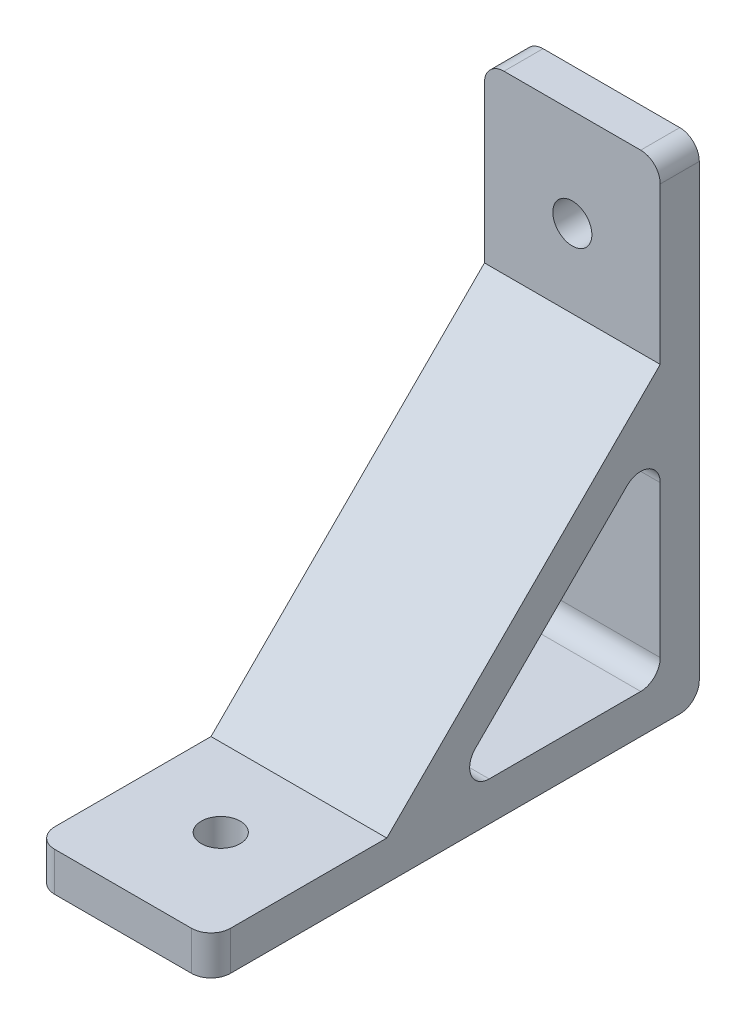
ISO-10303-21;
HEADER;
FILE_DESCRIPTION(('STEP AP214'),'2;1');
FILE_NAME('part.step','',(''),(''),'','','');
FILE_SCHEMA(('AUTOMOTIVE_DESIGN { 1 0 10303 214 1 1 1 1 }'));
ENDSEC;
DATA;
#1=APPLICATION_CONTEXT('core data for automotive mechanical design processes');
#2=APPLICATION_PROTOCOL_DEFINITION('international standard','automotive_design',2000,#1);
#3=PRODUCT_CONTEXT('',#1,'mechanical');
#4=PRODUCT('Part','Part','',(#3));
#5=PRODUCT_RELATED_PRODUCT_CATEGORY('part','',(#4));
#6=PRODUCT_DEFINITION_FORMATION('','',#4);
#7=PRODUCT_DEFINITION_CONTEXT('part definition',#1,'design');
#8=PRODUCT_DEFINITION('design','',#6,#7);
#9=PRODUCT_DEFINITION_SHAPE('','',#8);
#10=(LENGTH_UNIT() NAMED_UNIT(*) SI_UNIT(.MILLI.,.METRE.));
#11=(NAMED_UNIT(*) PLANE_ANGLE_UNIT() SI_UNIT($,.RADIAN.));
#12=(NAMED_UNIT(*) SI_UNIT($,.STERADIAN.) SOLID_ANGLE_UNIT());
#13=UNCERTAINTY_MEASURE_WITH_UNIT(LENGTH_MEASURE(1.E-05),#10,'distance_accuracy_value','');
#14=(GEOMETRIC_REPRESENTATION_CONTEXT(3) GLOBAL_UNCERTAINTY_ASSIGNED_CONTEXT((#13)) GLOBAL_UNIT_ASSIGNED_CONTEXT((#10,
#11,#12)) REPRESENTATION_CONTEXT('',''));
#15=CARTESIAN_POINT('',(0.,0.,0.));
#16=DIRECTION('',(0.,0.,1.));
#17=DIRECTION('',(1.,0.,0.));
#18=AXIS2_PLACEMENT_3D('',#15,#16,#17);
#19=CARTESIAN_POINT('',(18.,100.,-50.));
#20=DIRECTION('',(-1.,0.,0.));
#21=DIRECTION('',(0.,0.,1.));
#22=AXIS2_PLACEMENT_3D('',#19,#20,#21);
#23=PLANE('',#22);
#24=DIRECTION('',(0.,0.,-1.));
#25=VECTOR('',#24,1.);
#26=CARTESIAN_POINT('',(18.,8.,-38.));
#27=LINE('',#26,#25);
#28=CARTESIAN_POINT('',(18.,8.,-6.97056274847713));
#29=VERTEX_POINT('',#28);
#30=CARTESIAN_POINT('',(18.,8.,-38.));
#31=VERTEX_POINT('',#30);
#32=EDGE_CURVE('E229',#29,#31,#27,.T.);
#33=ORIENTED_EDGE('',*,*,#32,.F.);
#34=CARTESIAN_POINT('',(18.,12.,-6.97056274847713));
#35=DIRECTION('',(1.,0.,0.));
#36=DIRECTION('',(0.,0.,-1.));
#37=AXIS2_PLACEMENT_3D('',#34,#35,#36);
#38=CIRCLE('',#37,4.);
#39=CARTESIAN_POINT('',(18.,14.8284271247462,-4.14213562373094));
#40=VERTEX_POINT('',#39);
#41=EDGE_CURVE('E181',#40,#29,#38,.T.);
#42=ORIENTED_EDGE('',*,*,#41,.F.);
#43=DIRECTION('',(0.,-0.707106781186548,0.707106781186547));
#44=VECTOR('',#43,1.);
#45=CARTESIAN_POINT('',(18.,14.8284271247462,-4.14213562373094));
#46=LINE('',#45,#44);
#47=CARTESIAN_POINT('',(18.,45.8578643762691,-35.1715728752538));
#48=VERTEX_POINT('',#47);
#49=EDGE_CURVE('E313',#48,#40,#46,.T.);
#50=ORIENTED_EDGE('',*,*,#49,.F.);
#51=CARTESIAN_POINT('',(18.,43.0294372515229,-38.));
#52=DIRECTION('',(1.,0.,0.));
#53=DIRECTION('',(0.,0.,-1.));
#54=AXIS2_PLACEMENT_3D('',#51,#52,#53);
#55=CIRCLE('',#54,4.);
#56=CARTESIAN_POINT('',(18.,43.0294372515229,-42.));
#57=VERTEX_POINT('',#56);
#58=EDGE_CURVE('E310',#57,#48,#55,.T.);
#59=ORIENTED_EDGE('',*,*,#58,.F.);
#60=DIRECTION('',(0.,1.,0.));
#61=VECTOR('',#60,1.);
#62=CARTESIAN_POINT('',(18.,43.0294372515229,-42.));
#63=LINE('',#62,#61);
#64=CARTESIAN_POINT('',(18.,12.,-42.));
#65=VERTEX_POINT('',#64);
#66=EDGE_CURVE('E307',#65,#57,#63,.T.);
#67=ORIENTED_EDGE('',*,*,#66,.F.);
#68=CARTESIAN_POINT('',(18.,12.,-38.));
#69=DIRECTION('',(1.,0.,0.));
#70=DIRECTION('',(0.,0.,-1.));
#71=AXIS2_PLACEMENT_3D('',#68,#69,#70);
#72=CIRCLE('',#71,4.);
#73=EDGE_CURVE('E304',#31,#65,#72,.T.);
#74=ORIENTED_EDGE('',*,*,#73,.F.);
#75=EDGE_LOOP('',(#33,#42,#50,#59,#67,#74));
#76=FACE_BOUND('',#75,.T.);
#77=DIRECTION('',(0.,0.,-1.));
#78=VECTOR('',#77,1.);
#79=CARTESIAN_POINT('',(18.,0.,-50.));
#80=LINE('',#79,#78);
#81=CARTESIAN_POINT('',(18.,0.,46.));
#82=VERTEX_POINT('',#81);
#83=CARTESIAN_POINT('',(18.,0.,-46.));
#84=VERTEX_POINT('',#83);
#85=EDGE_CURVE('E273',#82,#84,#80,.T.);
#86=ORIENTED_EDGE('',*,*,#85,.T.);
#87=CARTESIAN_POINT('',(18.,4.,-46.));
#88=DIRECTION('',(-1.,0.,0.));
#89=DIRECTION('',(0.,0.,1.));
#90=AXIS2_PLACEMENT_3D('',#87,#88,#89);
#91=CIRCLE('',#90,4.);
#92=CARTESIAN_POINT('',(18.,4.,-50.));
#93=VERTEX_POINT('',#92);
#94=EDGE_CURVE('E352',#84,#93,#91,.F.);
#95=ORIENTED_EDGE('',*,*,#94,.T.);
#96=DIRECTION('',(0.,-1.,0.));
#97=VECTOR('',#96,1.);
#98=CARTESIAN_POINT('',(18.,100.,-50.));
#99=LINE('',#98,#97);
#100=CARTESIAN_POINT('',(18.,96.,-50.));
#101=VERTEX_POINT('',#100);
#102=EDGE_CURVE('E293',#101,#93,#99,.T.);
#103=ORIENTED_EDGE('',*,*,#102,.F.);
#104=DIRECTION('',(0.,0.,-1.));
#105=VECTOR('',#104,1.);
#106=CARTESIAN_POINT('',(18.,96.,-42.));
#107=LINE('',#106,#105);
#108=CARTESIAN_POINT('',(18.,96.,-42.));
#109=VERTEX_POINT('',#108);
#110=EDGE_CURVE('E345',#101,#109,#107,.F.);
#111=ORIENTED_EDGE('',*,*,#110,.T.);
#112=DIRECTION('',(0.,-1.,0.));
#113=VECTOR('',#112,1.);
#114=CARTESIAN_POINT('',(18.,0.,-42.));
#115=LINE('',#114,#113);
#116=CARTESIAN_POINT('',(18.,64.,-42.));
#117=VERTEX_POINT('',#116);
#118=EDGE_CURVE('E240',#109,#117,#115,.T.);
#119=ORIENTED_EDGE('',*,*,#118,.T.);
#120=DIRECTION('',(0.,-0.707106781186548,0.707106781186547));
#121=VECTOR('',#120,1.);
#122=CARTESIAN_POINT('',(18.,11.,11.));
#123=LINE('',#122,#121);
#124=CARTESIAN_POINT('',(18.,7.99999999999999,14.));
#125=VERTEX_POINT('',#124);
#126=EDGE_CURVE('E243',#117,#125,#123,.T.);
#127=ORIENTED_EDGE('',*,*,#126,.T.);
#128=DIRECTION('',(0.,0.,-1.));
#129=VECTOR('',#128,1.);
#130=CARTESIAN_POINT('',(18.,7.99999999999999,0.));
#131=LINE('',#130,#129);
#132=CARTESIAN_POINT('',(18.,8.,46.));
#133=VERTEX_POINT('',#132);
#134=EDGE_CURVE('E247',#133,#125,#131,.T.);
#135=ORIENTED_EDGE('',*,*,#134,.F.);
#136=DIRECTION('',(0.,-1.,0.));
#137=VECTOR('',#136,1.);
#138=CARTESIAN_POINT('',(18.,100.,46.));
#139=LINE('',#138,#137);
#140=EDGE_CURVE('E348',#133,#82,#139,.T.);
#141=ORIENTED_EDGE('',*,*,#140,.T.);
#142=EDGE_LOOP('',(#86,#95,#103,#111,#119,#127,#135,#141));
#143=FACE_BOUND('',#142,.T.);
#144=ADVANCED_FACE('F45',(#76,#143),#23,.F.);
#145=CARTESIAN_POINT('',(-18.,100.,-50.));
#146=DIRECTION('',(1.,0.,0.));
#147=DIRECTION('',(0.,0.,-1.));
#148=AXIS2_PLACEMENT_3D('',#145,#146,#147);
#149=PLANE('',#148);
#150=DIRECTION('',(0.,-0.707106781186548,0.707106781186547));
#151=VECTOR('',#150,1.);
#152=CARTESIAN_POINT('',(-18.,14.8284271247462,-4.14213562373094));
#153=LINE('',#152,#151);
#154=CARTESIAN_POINT('',(-18.,45.8578643762691,-35.1715728752538));
#155=VERTEX_POINT('',#154);
#156=CARTESIAN_POINT('',(-18.,14.8284271247462,-4.14213562373094));
#157=VERTEX_POINT('',#156);
#158=EDGE_CURVE('E186',#155,#157,#153,.T.);
#159=ORIENTED_EDGE('',*,*,#158,.T.);
#160=CARTESIAN_POINT('',(-18.,12.,-6.97056274847713));
#161=DIRECTION('',(1.,0.,0.));
#162=DIRECTION('',(0.,0.,1.));
#163=AXIS2_PLACEMENT_3D('',#160,#161,#162);
#164=CIRCLE('',#163,4.);
#165=CARTESIAN_POINT('',(-18.,8.,-6.97056274847713));
#166=VERTEX_POINT('',#165);
#167=EDGE_CURVE('E178',#157,#166,#164,.T.);
#168=ORIENTED_EDGE('',*,*,#167,.T.);
#169=DIRECTION('',(0.,0.,-1.));
#170=VECTOR('',#169,1.);
#171=CARTESIAN_POINT('',(-18.,8.,-38.));
#172=LINE('',#171,#170);
#173=CARTESIAN_POINT('',(-18.,8.00000000000001,-38.));
#174=VERTEX_POINT('',#173);
#175=EDGE_CURVE('E190',#166,#174,#172,.T.);
#176=ORIENTED_EDGE('',*,*,#175,.T.);
#177=CARTESIAN_POINT('',(-18.,12.,-38.));
#178=DIRECTION('',(1.,0.,0.));
#179=DIRECTION('',(0.,0.,-1.));
#180=AXIS2_PLACEMENT_3D('',#177,#178,#179);
#181=CIRCLE('',#180,4.);
#182=CARTESIAN_POINT('',(-18.,12.,-42.));
#183=VERTEX_POINT('',#182);
#184=EDGE_CURVE('E196',#174,#183,#181,.T.);
#185=ORIENTED_EDGE('',*,*,#184,.T.);
#186=DIRECTION('',(0.,1.,0.));
#187=VECTOR('',#186,1.);
#188=CARTESIAN_POINT('',(-18.,43.0294372515229,-42.));
#189=LINE('',#188,#187);
#190=CARTESIAN_POINT('',(-18.,43.0294372515229,-42.));
#191=VERTEX_POINT('',#190);
#192=EDGE_CURVE('E213',#183,#191,#189,.T.);
#193=ORIENTED_EDGE('',*,*,#192,.T.);
#194=CARTESIAN_POINT('',(-18.,43.0294372515229,-38.));
#195=DIRECTION('',(1.,0.,0.));
#196=DIRECTION('',(0.,0.,-1.));
#197=AXIS2_PLACEMENT_3D('',#194,#195,#196);
#198=CIRCLE('',#197,4.);
#199=EDGE_CURVE('E217',#191,#155,#198,.T.);
#200=ORIENTED_EDGE('',*,*,#199,.T.);
#201=EDGE_LOOP('',(#159,#168,#176,#185,#193,#200));
#202=FACE_BOUND('',#201,.T.);
#203=DIRECTION('',(0.,-1.,0.));
#204=VECTOR('',#203,1.);
#205=CARTESIAN_POINT('',(-18.,100.,-50.));
#206=LINE('',#205,#204);
#207=CARTESIAN_POINT('',(-18.,96.,-50.));
#208=VERTEX_POINT('',#207);
#209=CARTESIAN_POINT('',(-18.,4.,-50.));
#210=VERTEX_POINT('',#209);
#211=EDGE_CURVE('E278',#208,#210,#206,.T.);
#212=ORIENTED_EDGE('',*,*,#211,.T.);
#213=CARTESIAN_POINT('',(-18.,4.,-46.));
#214=DIRECTION('',(1.,0.,0.));
#215=DIRECTION('',(0.,0.,-1.));
#216=AXIS2_PLACEMENT_3D('',#213,#214,#215);
#217=CIRCLE('',#216,4.);
#218=CARTESIAN_POINT('',(-18.,0.,-46.));
#219=VERTEX_POINT('',#218);
#220=EDGE_CURVE('E333',#210,#219,#217,.F.);
#221=ORIENTED_EDGE('',*,*,#220,.T.);
#222=DIRECTION('',(0.,0.,1.));
#223=VECTOR('',#222,1.);
#224=CARTESIAN_POINT('',(-18.,0.,-50.));
#225=LINE('',#224,#223);
#226=CARTESIAN_POINT('',(-18.,0.,46.));
#227=VERTEX_POINT('',#226);
#228=EDGE_CURVE('E283',#219,#227,#225,.T.);
#229=ORIENTED_EDGE('',*,*,#228,.T.);
#230=DIRECTION('',(0.,-1.,0.));
#231=VECTOR('',#230,1.);
#232=CARTESIAN_POINT('',(-18.,100.,46.));
#233=LINE('',#232,#231);
#234=CARTESIAN_POINT('',(-18.,7.99999999999999,46.));
#235=VERTEX_POINT('',#234);
#236=EDGE_CURVE('E330',#227,#235,#233,.F.);
#237=ORIENTED_EDGE('',*,*,#236,.T.);
#238=DIRECTION('',(0.,0.,1.));
#239=VECTOR('',#238,1.);
#240=CARTESIAN_POINT('',(-18.,7.99999999999998,-50.));
#241=LINE('',#240,#239);
#242=CARTESIAN_POINT('',(-18.,7.99999999999999,14.));
#243=VERTEX_POINT('',#242);
#244=EDGE_CURVE('E269',#243,#235,#241,.T.);
#245=ORIENTED_EDGE('',*,*,#244,.F.);
#246=DIRECTION('',(0.,0.707106781186548,-0.707106781186547));
#247=VECTOR('',#246,1.);
#248=CARTESIAN_POINT('',(-18.,86.,-64.));
#249=LINE('',#248,#247);
#250=CARTESIAN_POINT('',(-18.,64.,-42.));
#251=VERTEX_POINT('',#250);
#252=EDGE_CURVE('E297',#243,#251,#249,.T.);
#253=ORIENTED_EDGE('',*,*,#252,.T.);
#254=DIRECTION('',(0.,1.,0.));
#255=VECTOR('',#254,1.);
#256=CARTESIAN_POINT('',(-18.,100.,-42.));
#257=LINE('',#256,#255);
#258=CARTESIAN_POINT('',(-18.,96.,-42.));
#259=VERTEX_POINT('',#258);
#260=EDGE_CURVE('E255',#251,#259,#257,.T.);
#261=ORIENTED_EDGE('',*,*,#260,.T.);
#262=DIRECTION('',(0.,0.,1.));
#263=VECTOR('',#262,1.);
#264=CARTESIAN_POINT('',(-18.,96.,-50.));
#265=LINE('',#264,#263);
#266=EDGE_CURVE('E327',#259,#208,#265,.F.);
#267=ORIENTED_EDGE('',*,*,#266,.T.);
#268=EDGE_LOOP('',(#212,#221,#229,#237,#245,#253,#261,#267));
#269=FACE_BOUND('',#268,.T.);
#270=ADVANCED_FACE('F198',(#202,#269),#149,.F.);
#271=CARTESIAN_POINT('',(-18.,100.,50.));
#272=DIRECTION('',(0.,0.,-1.));
#273=DIRECTION('',(-1.,0.,0.));
#274=AXIS2_PLACEMENT_3D('',#271,#272,#273);
#275=PLANE('',#274);
#276=DIRECTION('',(-1.,0.,0.));
#277=VECTOR('',#276,1.);
#278=CARTESIAN_POINT('',(18.,8.,50.));
#279=LINE('',#278,#277);
#280=CARTESIAN_POINT('',(14.,8.,50.));
#281=VERTEX_POINT('',#280);
#282=CARTESIAN_POINT('',(-14.,8.,50.));
#283=VERTEX_POINT('',#282);
#284=EDGE_CURVE('E251',#281,#283,#279,.T.);
#285=ORIENTED_EDGE('',*,*,#284,.T.);
#286=DIRECTION('',(0.,-1.,0.));
#287=VECTOR('',#286,1.);
#288=CARTESIAN_POINT('',(-14.,100.,50.));
#289=LINE('',#288,#287);
#290=CARTESIAN_POINT('',(-14.,0.,50.));
#291=VERTEX_POINT('',#290);
#292=EDGE_CURVE('E358',#283,#291,#289,.T.);
#293=ORIENTED_EDGE('',*,*,#292,.T.);
#294=DIRECTION('',(1.,0.,0.));
#295=VECTOR('',#294,1.);
#296=CARTESIAN_POINT('',(-18.,0.,50.));
#297=LINE('',#296,#295);
#298=CARTESIAN_POINT('',(14.,0.,50.));
#299=VERTEX_POINT('',#298);
#300=EDGE_CURVE('E279',#291,#299,#297,.T.);
#301=ORIENTED_EDGE('',*,*,#300,.T.);
#302=DIRECTION('',(0.,-1.,0.));
#303=VECTOR('',#302,1.);
#304=CARTESIAN_POINT('',(14.,100.,50.));
#305=LINE('',#304,#303);
#306=EDGE_CURVE('E355',#299,#281,#305,.F.);
#307=ORIENTED_EDGE('',*,*,#306,.T.);
#308=EDGE_LOOP('',(#285,#293,#301,#307));
#309=FACE_BOUND('',#308,.T.);
#310=ADVANCED_FACE('F408',(#309),#275,.F.);
#311=CARTESIAN_POINT('',(-18.,100.,-50.));
#312=DIRECTION('',(0.,0.,1.));
#313=DIRECTION('',(1.,0.,0.));
#314=AXIS2_PLACEMENT_3D('',#311,#312,#313);
#315=PLANE('',#314);
#316=CARTESIAN_POINT('',(0.,80.,-50.));
#317=DIRECTION('',(0.,0.,1.));
#318=DIRECTION('',(1.,0.,0.));
#319=AXIS2_PLACEMENT_3D('',#316,#317,#318);
#320=CIRCLE('',#319,4.00000000000001);
#321=CARTESIAN_POINT('',(4.,80.,-50.));
#322=VERTEX_POINT('',#321);
#323=EDGE_CURVE('E503',#322,#322,#320,.T.);
#324=ORIENTED_EDGE('',*,*,#323,.T.);
#325=EDGE_LOOP('',(#324));
#326=FACE_BOUND('',#325,.T.);
#327=ORIENTED_EDGE('',*,*,#102,.T.);
#328=DIRECTION('',(-1.,0.,0.));
#329=VECTOR('',#328,1.);
#330=CARTESIAN_POINT('',(-18.,4.,-50.));
#331=LINE('',#330,#329);
#332=EDGE_CURVE('E323',#93,#210,#331,.T.);
#333=ORIENTED_EDGE('',*,*,#332,.T.);
#334=ORIENTED_EDGE('',*,*,#211,.F.);
#335=CARTESIAN_POINT('',(-14.,96.,-50.));
#336=DIRECTION('',(0.,0.,1.));
#337=DIRECTION('',(1.,0.,0.));
#338=AXIS2_PLACEMENT_3D('',#335,#336,#337);
#339=CIRCLE('',#338,4.);
#340=CARTESIAN_POINT('',(-14.,100.,-50.));
#341=VERTEX_POINT('',#340);
#342=EDGE_CURVE('E301',#208,#341,#339,.F.);
#343=ORIENTED_EDGE('',*,*,#342,.T.);
#344=DIRECTION('',(-1.,0.,0.));
#345=VECTOR('',#344,1.);
#346=CARTESIAN_POINT('',(-18.,100.,-50.));
#347=LINE('',#346,#345);
#348=CARTESIAN_POINT('',(14.,100.,-50.));
#349=VERTEX_POINT('',#348);
#350=EDGE_CURVE('E274',#349,#341,#347,.T.);
#351=ORIENTED_EDGE('',*,*,#350,.F.);
#352=CARTESIAN_POINT('',(14.,96.,-50.));
#353=DIRECTION('',(0.,0.,1.));
#354=DIRECTION('',(1.,0.,0.));
#355=AXIS2_PLACEMENT_3D('',#352,#353,#354);
#356=CIRCLE('',#355,4.);
#357=EDGE_CURVE('E320',#349,#101,#356,.F.);
#358=ORIENTED_EDGE('',*,*,#357,.T.);
#359=EDGE_LOOP('',(#327,#333,#334,#343,#351,#358));
#360=FACE_BOUND('',#359,.T.);
#361=ADVANCED_FACE('F383',(#326,#360),#315,.F.);
#362=CARTESIAN_POINT('',(0.,100.,0.));
#363=DIRECTION('',(0.,1.,0.));
#364=DIRECTION('',(0.,0.,1.));
#365=AXIS2_PLACEMENT_3D('',#362,#363,#364);
#366=PLANE('',#365);
#367=DIRECTION('',(-1.,0.,0.));
#368=VECTOR('',#367,1.);
#369=CARTESIAN_POINT('',(18.,100.,-42.));
#370=LINE('',#369,#368);
#371=CARTESIAN_POINT('',(14.,100.,-42.));
#372=VERTEX_POINT('',#371);
#373=CARTESIAN_POINT('',(-14.,100.,-42.));
#374=VERTEX_POINT('',#373);
#375=EDGE_CURVE('E250',#372,#374,#370,.T.);
#376=ORIENTED_EDGE('',*,*,#375,.F.);
#377=DIRECTION('',(0.,0.,-1.));
#378=VECTOR('',#377,1.);
#379=CARTESIAN_POINT('',(14.,100.,-50.));
#380=LINE('',#379,#378);
#381=EDGE_CURVE('E371',#372,#349,#380,.T.);
#382=ORIENTED_EDGE('',*,*,#381,.T.);
#383=ORIENTED_EDGE('',*,*,#350,.T.);
#384=DIRECTION('',(0.,0.,1.));
#385=VECTOR('',#384,1.);
#386=CARTESIAN_POINT('',(-14.,100.,-42.));
#387=LINE('',#386,#385);
#388=EDGE_CURVE('E368',#341,#374,#387,.T.);
#389=ORIENTED_EDGE('',*,*,#388,.T.);
#390=EDGE_LOOP('',(#376,#382,#383,#389));
#391=FACE_BOUND('',#390,.T.);
#392=ADVANCED_FACE('F385',(#391),#366,.T.);
#393=CARTESIAN_POINT('',(0.,0.,0.));
#394=DIRECTION('',(0.,1.,0.));
#395=DIRECTION('',(0.,0.,1.));
#396=AXIS2_PLACEMENT_3D('',#393,#394,#395);
#397=PLANE('',#396);
#398=CARTESIAN_POINT('',(0.,0.,30.));
#399=DIRECTION('',(0.,1.,0.));
#400=DIRECTION('',(0.,0.,1.));
#401=AXIS2_PLACEMENT_3D('',#398,#399,#400);
#402=CIRCLE('',#401,4.);
#403=CARTESIAN_POINT('',(0.,0.,34.));
#404=VERTEX_POINT('',#403);
#405=EDGE_CURVE('E207',#404,#404,#402,.T.);
#406=ORIENTED_EDGE('',*,*,#405,.T.);
#407=EDGE_LOOP('',(#406));
#408=FACE_BOUND('',#407,.T.);
#409=ORIENTED_EDGE('',*,*,#228,.F.);
#410=DIRECTION('',(-1.,0.,0.));
#411=VECTOR('',#410,1.);
#412=CARTESIAN_POINT('',(0.,0.,-46.));
#413=LINE('',#412,#411);
#414=EDGE_CURVE('E342',#219,#84,#413,.F.);
#415=ORIENTED_EDGE('',*,*,#414,.T.);
#416=ORIENTED_EDGE('',*,*,#85,.F.);
#417=CARTESIAN_POINT('',(14.,0.,46.));
#418=DIRECTION('',(0.,1.,0.));
#419=DIRECTION('',(0.,0.,1.));
#420=AXIS2_PLACEMENT_3D('',#417,#418,#419);
#421=CIRCLE('',#420,4.);
#422=EDGE_CURVE('E336',#82,#299,#421,.F.);
#423=ORIENTED_EDGE('',*,*,#422,.T.);
#424=ORIENTED_EDGE('',*,*,#300,.F.);
#425=CARTESIAN_POINT('',(-14.,0.,46.));
#426=DIRECTION('',(0.,1.,0.));
#427=DIRECTION('',(0.,0.,1.));
#428=AXIS2_PLACEMENT_3D('',#425,#426,#427);
#429=CIRCLE('',#428,4.);
#430=EDGE_CURVE('E339',#291,#227,#429,.F.);
#431=ORIENTED_EDGE('',*,*,#430,.T.);
#432=EDGE_LOOP('',(#409,#415,#416,#423,#424,#431));
#433=FACE_BOUND('',#432,.T.);
#434=ADVANCED_FACE('F401',(#408,#433),#397,.F.);
#435=CARTESIAN_POINT('',(18.,11.,11.));
#436=DIRECTION('',(0.,-0.707106781186547,-0.707106781186548));
#437=DIRECTION('',(0.,0.707106781186548,-0.707106781186547));
#438=AXIS2_PLACEMENT_3D('',#435,#436,#437);
#439=PLANE('',#438);
#440=DIRECTION('',(-1.,0.,0.));
#441=VECTOR('',#440,1.);
#442=CARTESIAN_POINT('',(18.,7.99999999999999,14.));
#443=LINE('',#442,#441);
#444=EDGE_CURVE('E256',#125,#243,#443,.T.);
#445=ORIENTED_EDGE('',*,*,#444,.F.);
#446=ORIENTED_EDGE('',*,*,#126,.F.);
#447=DIRECTION('',(-1.,0.,0.));
#448=VECTOR('',#447,1.);
#449=CARTESIAN_POINT('',(18.,64.,-42.));
#450=LINE('',#449,#448);
#451=EDGE_CURVE('E260',#117,#251,#450,.T.);
#452=ORIENTED_EDGE('',*,*,#451,.T.);
#453=ORIENTED_EDGE('',*,*,#252,.F.);
#454=EDGE_LOOP('',(#445,#446,#452,#453));
#455=FACE_BOUND('',#454,.T.);
#456=ADVANCED_FACE('F421',(#455),#439,.F.);
#457=CARTESIAN_POINT('',(18.,7.99999999999999,0.));
#458=DIRECTION('',(0.,1.,0.));
#459=DIRECTION('',(0.,0.,1.));
#460=AXIS2_PLACEMENT_3D('',#457,#458,#459);
#461=PLANE('',#460);
#462=CARTESIAN_POINT('',(0.,8.,30.));
#463=DIRECTION('',(0.,1.,0.));
#464=DIRECTION('',(0.,0.,1.));
#465=AXIS2_PLACEMENT_3D('',#462,#463,#464);
#466=CIRCLE('',#465,4.);
#467=CARTESIAN_POINT('',(0.,8.,34.));
#468=VERTEX_POINT('',#467);
#469=EDGE_CURVE('E203',#468,#468,#466,.T.);
#470=ORIENTED_EDGE('',*,*,#469,.F.);
#471=EDGE_LOOP('',(#470));
#472=FACE_BOUND('',#471,.T.);
#473=ORIENTED_EDGE('',*,*,#244,.T.);
#474=CARTESIAN_POINT('',(-14.,7.99999999999999,46.));
#475=DIRECTION('',(0.,1.,0.));
#476=DIRECTION('',(0.,0.,1.));
#477=AXIS2_PLACEMENT_3D('',#474,#475,#476);
#478=CIRCLE('',#477,4.);
#479=EDGE_CURVE('E365',#235,#283,#478,.T.);
#480=ORIENTED_EDGE('',*,*,#479,.T.);
#481=ORIENTED_EDGE('',*,*,#284,.F.);
#482=CARTESIAN_POINT('',(14.,7.99999999999999,46.));
#483=DIRECTION('',(0.,1.,0.));
#484=DIRECTION('',(0.,0.,1.));
#485=AXIS2_PLACEMENT_3D('',#482,#483,#484);
#486=CIRCLE('',#485,4.);
#487=EDGE_CURVE('E362',#281,#133,#486,.T.);
#488=ORIENTED_EDGE('',*,*,#487,.T.);
#489=ORIENTED_EDGE('',*,*,#134,.T.);
#490=ORIENTED_EDGE('',*,*,#444,.T.);
#491=EDGE_LOOP('',(#473,#480,#481,#488,#489,#490));
#492=FACE_BOUND('',#491,.T.);
#493=ADVANCED_FACE('F413',(#472,#492),#461,.T.);
#494=CARTESIAN_POINT('',(18.,0.,-42.));
#495=DIRECTION('',(0.,0.,-1.));
#496=DIRECTION('',(-1.,0.,0.));
#497=AXIS2_PLACEMENT_3D('',#494,#495,#496);
#498=PLANE('',#497);
#499=CARTESIAN_POINT('',(0.,80.,-42.));
#500=DIRECTION('',(0.,0.,-1.));
#501=DIRECTION('',(-1.,0.,0.));
#502=AXIS2_PLACEMENT_3D('',#499,#500,#501);
#503=CIRCLE('',#502,4.00000000000001);
#504=CARTESIAN_POINT('',(-4.00000000000001,80.,-42.));
#505=VERTEX_POINT('',#504);
#506=EDGE_CURVE('E49',#505,#505,#503,.T.);
#507=ORIENTED_EDGE('',*,*,#506,.T.);
#508=EDGE_LOOP('',(#507));
#509=FACE_BOUND('',#508,.T.);
#510=ORIENTED_EDGE('',*,*,#118,.F.);
#511=CARTESIAN_POINT('',(14.,96.,-42.));
#512=DIRECTION('',(0.,0.,-1.));
#513=DIRECTION('',(-1.,0.,0.));
#514=AXIS2_PLACEMENT_3D('',#511,#512,#513);
#515=CIRCLE('',#514,4.);
#516=EDGE_CURVE('E11',#109,#372,#515,.F.);
#517=ORIENTED_EDGE('',*,*,#516,.T.);
#518=ORIENTED_EDGE('',*,*,#375,.T.);
#519=CARTESIAN_POINT('',(-14.,96.,-42.));
#520=DIRECTION('',(0.,0.,-1.));
#521=DIRECTION('',(-1.,0.,0.));
#522=AXIS2_PLACEMENT_3D('',#519,#520,#521);
#523=CIRCLE('',#522,4.);
#524=EDGE_CURVE('E55',#374,#259,#523,.F.);
#525=ORIENTED_EDGE('',*,*,#524,.T.);
#526=ORIENTED_EDGE('',*,*,#260,.F.);
#527=ORIENTED_EDGE('',*,*,#451,.F.);
#528=EDGE_LOOP('',(#510,#517,#518,#525,#526,#527));
#529=FACE_BOUND('',#528,.T.);
#530=ADVANCED_FACE('F376',(#509,#529),#498,.F.);
#531=CARTESIAN_POINT('',(-18.,12.,-6.97056274847713));
#532=DIRECTION('',(1.,0.,0.));
#533=DIRECTION('',(0.,0.,-1.));
#534=AXIS2_PLACEMENT_3D('',#531,#532,#533);
#535=CYLINDRICAL_SURFACE('',#534,4.);
#536=DIRECTION('',(1.,0.,0.));
#537=VECTOR('',#536,1.);
#538=CARTESIAN_POINT('',(-18.,8.,-6.97056274847713));
#539=LINE('',#538,#537);
#540=EDGE_CURVE('E173',#166,#29,#539,.T.);
#541=ORIENTED_EDGE('',*,*,#540,.F.);
#542=ORIENTED_EDGE('',*,*,#167,.F.);
#543=DIRECTION('',(1.,0.,0.));
#544=VECTOR('',#543,1.);
#545=CARTESIAN_POINT('',(-18.,14.8284271247462,-4.14213562373094));
#546=LINE('',#545,#544);
#547=EDGE_CURVE('E226',#157,#40,#546,.T.);
#548=ORIENTED_EDGE('',*,*,#547,.T.);
#549=ORIENTED_EDGE('',*,*,#41,.T.);
#550=EDGE_LOOP('',(#541,#542,#548,#549));
#551=FACE_BOUND('',#550,.T.);
#552=ADVANCED_FACE('F175',(#551),#535,.F.);
#553=CARTESIAN_POINT('',(-18.,14.8284271247462,-4.14213562373094));
#554=DIRECTION('',(0.,0.707106781186547,0.707106781186548));
#555=DIRECTION('',(0.,-0.707106781186548,0.707106781186547));
#556=AXIS2_PLACEMENT_3D('',#553,#554,#555);
#557=PLANE('',#556);
#558=ORIENTED_EDGE('',*,*,#547,.F.);
#559=ORIENTED_EDGE('',*,*,#158,.F.);
#560=DIRECTION('',(1.,0.,0.));
#561=VECTOR('',#560,1.);
#562=CARTESIAN_POINT('',(-18.,45.8578643762691,-35.1715728752538));
#563=LINE('',#562,#561);
#564=EDGE_CURVE('E222',#155,#48,#563,.T.);
#565=ORIENTED_EDGE('',*,*,#564,.T.);
#566=ORIENTED_EDGE('',*,*,#49,.T.);
#567=EDGE_LOOP('',(#558,#559,#565,#566));
#568=FACE_BOUND('',#567,.T.);
#569=ADVANCED_FACE('F468',(#568),#557,.F.);
#570=CARTESIAN_POINT('',(-18.,43.0294372515229,-38.));
#571=DIRECTION('',(1.,0.,0.));
#572=DIRECTION('',(0.,0.,-1.));
#573=AXIS2_PLACEMENT_3D('',#570,#571,#572);
#574=CYLINDRICAL_SURFACE('',#573,4.);
#575=ORIENTED_EDGE('',*,*,#564,.F.);
#576=ORIENTED_EDGE('',*,*,#199,.F.);
#577=DIRECTION('',(1.,0.,0.));
#578=VECTOR('',#577,1.);
#579=CARTESIAN_POINT('',(-18.,43.0294372515229,-42.));
#580=LINE('',#579,#578);
#581=EDGE_CURVE('E227',#191,#57,#580,.T.);
#582=ORIENTED_EDGE('',*,*,#581,.T.);
#583=ORIENTED_EDGE('',*,*,#58,.T.);
#584=EDGE_LOOP('',(#575,#576,#582,#583));
#585=FACE_BOUND('',#584,.T.);
#586=ADVANCED_FACE('F471',(#585),#574,.F.);
#587=CARTESIAN_POINT('',(-18.,43.0294372515229,-42.));
#588=DIRECTION('',(0.,0.,-1.));
#589=DIRECTION('',(-1.,0.,0.));
#590=AXIS2_PLACEMENT_3D('',#587,#588,#589);
#591=PLANE('',#590);
#592=ORIENTED_EDGE('',*,*,#581,.F.);
#593=ORIENTED_EDGE('',*,*,#192,.F.);
#594=DIRECTION('',(1.,0.,0.));
#595=VECTOR('',#594,1.);
#596=CARTESIAN_POINT('',(-18.,12.,-42.));
#597=LINE('',#596,#595);
#598=EDGE_CURVE('E234',#183,#65,#597,.T.);
#599=ORIENTED_EDGE('',*,*,#598,.T.);
#600=ORIENTED_EDGE('',*,*,#66,.T.);
#601=EDGE_LOOP('',(#592,#593,#599,#600));
#602=FACE_BOUND('',#601,.T.);
#603=ADVANCED_FACE('F475',(#602),#591,.F.);
#604=CARTESIAN_POINT('',(-18.,12.,-38.));
#605=DIRECTION('',(1.,0.,0.));
#606=DIRECTION('',(0.,0.,-1.));
#607=AXIS2_PLACEMENT_3D('',#604,#605,#606);
#608=CYLINDRICAL_SURFACE('',#607,4.);
#609=ORIENTED_EDGE('',*,*,#598,.F.);
#610=ORIENTED_EDGE('',*,*,#184,.F.);
#611=DIRECTION('',(1.,0.,0.));
#612=VECTOR('',#611,1.);
#613=CARTESIAN_POINT('',(-18.,8.,-38.));
#614=LINE('',#613,#612);
#615=EDGE_CURVE('E185',#174,#31,#614,.T.);
#616=ORIENTED_EDGE('',*,*,#615,.T.);
#617=ORIENTED_EDGE('',*,*,#73,.T.);
#618=EDGE_LOOP('',(#609,#610,#616,#617));
#619=FACE_BOUND('',#618,.T.);
#620=ADVANCED_FACE('F479',(#619),#608,.F.);
#621=CARTESIAN_POINT('',(-18.,8.,-38.));
#622=DIRECTION('',(0.,-1.,0.));
#623=DIRECTION('',(0.,0.,-1.));
#624=AXIS2_PLACEMENT_3D('',#621,#622,#623);
#625=PLANE('',#624);
#626=ORIENTED_EDGE('',*,*,#615,.F.);
#627=ORIENTED_EDGE('',*,*,#175,.F.);
#628=ORIENTED_EDGE('',*,*,#540,.T.);
#629=ORIENTED_EDGE('',*,*,#32,.T.);
#630=EDGE_LOOP('',(#626,#627,#628,#629));
#631=FACE_BOUND('',#630,.T.);
#632=ADVANCED_FACE('F191',(#631),#625,.F.);
#633=CARTESIAN_POINT('',(-18.,4.,-46.));
#634=DIRECTION('',(-1.,0.,0.));
#635=DIRECTION('',(0.,0.,1.));
#636=AXIS2_PLACEMENT_3D('',#633,#634,#635);
#637=CYLINDRICAL_SURFACE('',#636,4.);
#638=ORIENTED_EDGE('',*,*,#94,.F.);
#639=ORIENTED_EDGE('',*,*,#414,.F.);
#640=ORIENTED_EDGE('',*,*,#220,.F.);
#641=ORIENTED_EDGE('',*,*,#332,.F.);
#642=EDGE_LOOP('',(#638,#639,#640,#641));
#643=FACE_BOUND('',#642,.T.);
#644=ADVANCED_FACE('F397',(#643),#637,.T.);
#645=CARTESIAN_POINT('',(-14.,100.,46.));
#646=DIRECTION('',(0.,-1.,0.));
#647=DIRECTION('',(0.,0.,-1.));
#648=AXIS2_PLACEMENT_3D('',#645,#646,#647);
#649=CYLINDRICAL_SURFACE('',#648,4.);
#650=ORIENTED_EDGE('',*,*,#479,.F.);
#651=ORIENTED_EDGE('',*,*,#236,.F.);
#652=ORIENTED_EDGE('',*,*,#430,.F.);
#653=ORIENTED_EDGE('',*,*,#292,.F.);
#654=EDGE_LOOP('',(#650,#651,#652,#653));
#655=FACE_BOUND('',#654,.T.);
#656=ADVANCED_FACE('F406',(#655),#649,.T.);
#657=CARTESIAN_POINT('',(14.,100.,46.));
#658=DIRECTION('',(0.,-1.,0.));
#659=DIRECTION('',(0.,0.,-1.));
#660=AXIS2_PLACEMENT_3D('',#657,#658,#659);
#661=CYLINDRICAL_SURFACE('',#660,4.);
#662=ORIENTED_EDGE('',*,*,#487,.F.);
#663=ORIENTED_EDGE('',*,*,#306,.F.);
#664=ORIENTED_EDGE('',*,*,#422,.F.);
#665=ORIENTED_EDGE('',*,*,#140,.F.);
#666=EDGE_LOOP('',(#662,#663,#664,#665));
#667=FACE_BOUND('',#666,.T.);
#668=ADVANCED_FACE('F417',(#667),#661,.T.);
#669=CARTESIAN_POINT('',(14.,96.,0.));
#670=DIRECTION('',(0.,0.,1.));
#671=DIRECTION('',(1.,0.,0.));
#672=AXIS2_PLACEMENT_3D('',#669,#670,#671);
#673=CYLINDRICAL_SURFACE('',#672,4.);
#674=ORIENTED_EDGE('',*,*,#516,.F.);
#675=ORIENTED_EDGE('',*,*,#110,.F.);
#676=ORIENTED_EDGE('',*,*,#357,.F.);
#677=ORIENTED_EDGE('',*,*,#381,.F.);
#678=EDGE_LOOP('',(#674,#675,#676,#677));
#679=FACE_BOUND('',#678,.T.);
#680=ADVANCED_FACE('F388',(#679),#673,.T.);
#681=CARTESIAN_POINT('',(-14.,96.,0.));
#682=DIRECTION('',(0.,0.,-1.));
#683=DIRECTION('',(-1.,0.,0.));
#684=AXIS2_PLACEMENT_3D('',#681,#682,#683);
#685=CYLINDRICAL_SURFACE('',#684,4.);
#686=ORIENTED_EDGE('',*,*,#342,.F.);
#687=ORIENTED_EDGE('',*,*,#266,.F.);
#688=ORIENTED_EDGE('',*,*,#524,.F.);
#689=ORIENTED_EDGE('',*,*,#388,.F.);
#690=EDGE_LOOP('',(#686,#687,#688,#689));
#691=FACE_BOUND('',#690,.T.);
#692=ADVANCED_FACE('F47',(#691),#685,.T.);
#693=CARTESIAN_POINT('',(0.,0.,30.));
#694=DIRECTION('',(0.,1.,0.));
#695=DIRECTION('',(0.,0.,1.));
#696=AXIS2_PLACEMENT_3D('',#693,#694,#695);
#697=CYLINDRICAL_SURFACE('',#696,4.);
#698=ORIENTED_EDGE('',*,*,#469,.T.);
#699=EDGE_LOOP('',(#698));
#700=FACE_BOUND('',#699,.T.);
#701=ORIENTED_EDGE('',*,*,#405,.F.);
#702=EDGE_LOOP('',(#701));
#703=FACE_BOUND('',#702,.T.);
#704=ADVANCED_FACE('F453',(#700,#703),#697,.F.);
#705=CARTESIAN_POINT('',(0.,80.,-50.));
#706=DIRECTION('',(0.,0.,1.));
#707=DIRECTION('',(1.,0.,0.));
#708=AXIS2_PLACEMENT_3D('',#705,#706,#707);
#709=CYLINDRICAL_SURFACE('',#708,4.00000000000001);
#710=ORIENTED_EDGE('',*,*,#323,.F.);
#711=EDGE_LOOP('',(#710));
#712=FACE_BOUND('',#711,.T.);
#713=ORIENTED_EDGE('',*,*,#506,.F.);
#714=EDGE_LOOP('',(#713));
#715=FACE_BOUND('',#714,.T.);
#716=ADVANCED_FACE('F457',(#712,#715),#709,.F.);
#717=CLOSED_SHELL('',(#144,#270,#310,#361,#392,#434,#456,#493,#530,#552,#569,#586,#603,#620,
#632,#644,#656,#668,#680,#692,#704,#716));
#718=MANIFOLD_SOLID_BREP('B2',#717);
#719=ADVANCED_BREP_SHAPE_REPRESENTATION('',(#18,#718),#14);
#720=SHAPE_DEFINITION_REPRESENTATION(#9,#719);
ENDSEC;
END-ISO-10303-21;
